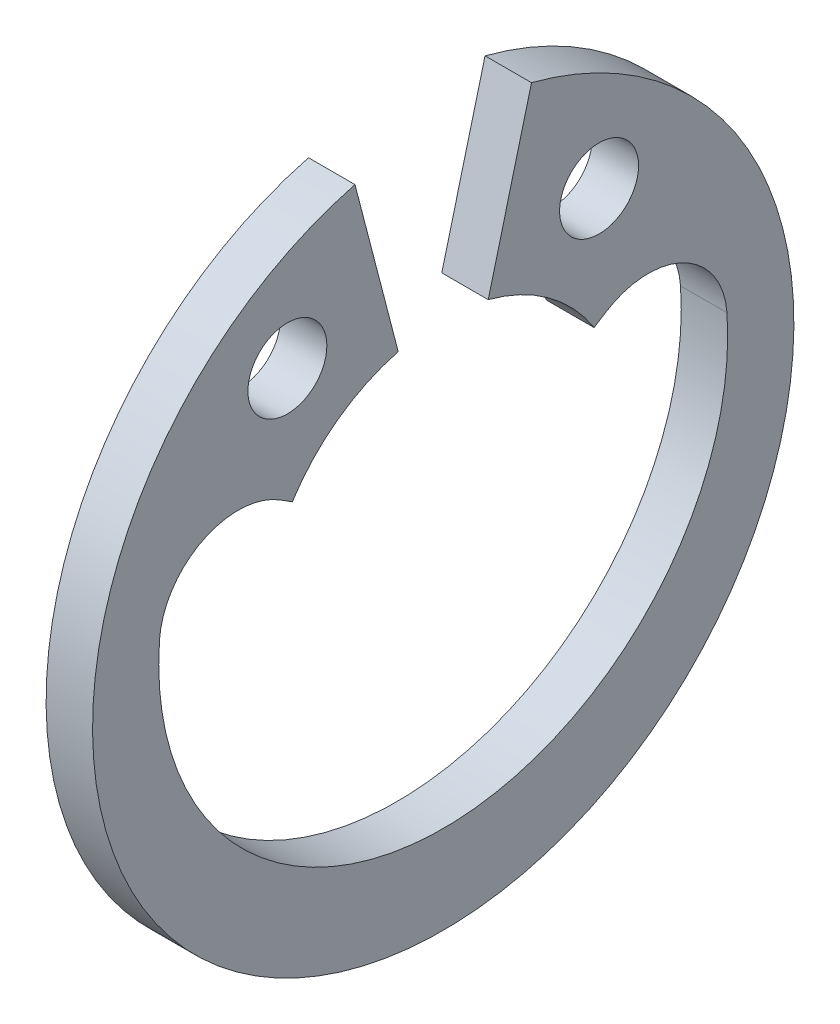
ISO-10303-21;
HEADER;
FILE_DESCRIPTION(('STEP AP214'),'2;1');
FILE_NAME('part.step','',(''),(''),'','','');
FILE_SCHEMA(('AUTOMOTIVE_DESIGN { 1 0 10303 214 1 1 1 1 }'));
ENDSEC;
DATA;
#1=APPLICATION_CONTEXT('core data for automotive mechanical design processes');
#2=APPLICATION_PROTOCOL_DEFINITION('international standard','automotive_design',2000,#1);
#3=PRODUCT_CONTEXT('',#1,'mechanical');
#4=PRODUCT('Part','Part','',(#3));
#5=PRODUCT_RELATED_PRODUCT_CATEGORY('part','',(#4));
#6=PRODUCT_DEFINITION_FORMATION('','',#4);
#7=PRODUCT_DEFINITION_CONTEXT('part definition',#1,'design');
#8=PRODUCT_DEFINITION('design','',#6,#7);
#9=PRODUCT_DEFINITION_SHAPE('','',#8);
#10=(LENGTH_UNIT() NAMED_UNIT(*) SI_UNIT(.MILLI.,.METRE.));
#11=(NAMED_UNIT(*) PLANE_ANGLE_UNIT() SI_UNIT($,.RADIAN.));
#12=(NAMED_UNIT(*) SI_UNIT($,.STERADIAN.) SOLID_ANGLE_UNIT());
#13=UNCERTAINTY_MEASURE_WITH_UNIT(LENGTH_MEASURE(1.E-05),#10,'distance_accuracy_value','');
#14=(GEOMETRIC_REPRESENTATION_CONTEXT(3) GLOBAL_UNCERTAINTY_ASSIGNED_CONTEXT((#13)) GLOBAL_UNIT_ASSIGNED_CONTEXT((#10,
#11,#12)) REPRESENTATION_CONTEXT('',''));
#15=CARTESIAN_POINT('',(0.,0.,0.));
#16=DIRECTION('',(0.,0.,1.));
#17=DIRECTION('',(1.,0.,0.));
#18=AXIS2_PLACEMENT_3D('',#15,#16,#17);
#19=CARTESIAN_POINT('',(0.,0.,0.));
#20=DIRECTION('',(1.,0.,0.));
#21=DIRECTION('',(0.,0.,-1.));
#22=AXIS2_PLACEMENT_3D('',#19,#20,#21);
#23=PLANE('',#22);
#24=DIRECTION('',(0.,0.967816844409425,0.251655629139073));
#25=VECTOR('',#24,1.);
#26=CARTESIAN_POINT('',(0.,3.72609485097629,0.968874172185431));
#27=LINE('',#26,#25);
#28=CARTESIAN_POINT('',(0.,3.72609485097629,0.968874172185432));
#29=VERTEX_POINT('',#28);
#30=CARTESIAN_POINT('',(0.,7.30701717529116,1.9));
#31=VERTEX_POINT('',#30);
#32=EDGE_CURVE('E173',#29,#31,#27,.T.);
#33=ORIENTED_EDGE('',*,*,#32,.F.);
#34=CARTESIAN_POINT('',(0.,0.,0.));
#35=DIRECTION('',(1.,0.,0.));
#36=DIRECTION('',(0.,0.,-1.));
#37=AXIS2_PLACEMENT_3D('',#34,#35,#36);
#38=CIRCLE('',#37,3.85);
#39=CARTESIAN_POINT('',(0.,2.0659171332523,3.24876690430917));
#40=VERTEX_POINT('',#39);
#41=EDGE_CURVE('E160',#29,#40,#38,.T.);
#42=ORIENTED_EDGE('',*,*,#41,.T.);
#43=DIRECTION('',(0.,-0.536601852792805,-0.843835559560824));
#44=VECTOR('',#43,1.);
#45=CARTESIAN_POINT('',(0.,2.22657105384902,3.50140392051924));
#46=LINE('',#45,#44);
#47=CARTESIAN_POINT('',(0.,2.22657105384902,3.50140392051924));
#48=VERTEX_POINT('',#47);
#49=EDGE_CURVE('E25',#48,#40,#46,.T.);
#50=ORIENTED_EDGE('',*,*,#49,.F.);
#51=CARTESIAN_POINT('',(0.,0.792050602595623,4.41362707026701));
#52=DIRECTION('',(1.,0.,0.));
#53=DIRECTION('',(0.,0.,-1.));
#54=AXIS2_PLACEMENT_3D('',#51,#52,#53);
#55=CIRCLE('',#54,1.7);
#56=CARTESIAN_POINT('',(0.,0.913855353875306,6.10925780912665));
#57=VERTEX_POINT('',#56);
#58=EDGE_CURVE('E102',#48,#57,#55,.T.);
#59=ORIENTED_EDGE('',*,*,#58,.T.);
#60=CARTESIAN_POINT('',(0.,0.475000000000007,0.));
#61=DIRECTION('',(1.,0.,0.));
#62=DIRECTION('',(0.,0.,-1.));
#63=AXIS2_PLACEMENT_3D('',#60,#61,#62);
#64=CIRCLE('',#63,6.125);
#65=CARTESIAN_POINT('',(0.,0.91385535387529,-6.10925780912666));
#66=VERTEX_POINT('',#65);
#67=EDGE_CURVE('E127',#57,#66,#64,.T.);
#68=ORIENTED_EDGE('',*,*,#67,.T.);
#69=CARTESIAN_POINT('',(0.,0.792050602595623,-4.41362707026701));
#70=DIRECTION('',(1.,0.,0.));
#71=DIRECTION('',(0.,0.,-1.));
#72=AXIS2_PLACEMENT_3D('',#69,#70,#71);
#73=CIRCLE('',#72,1.7);
#74=CARTESIAN_POINT('',(0.,2.22657105384902,-3.50140392051923));
#75=VERTEX_POINT('',#74);
#76=EDGE_CURVE('E132',#66,#75,#73,.T.);
#77=ORIENTED_EDGE('',*,*,#76,.T.);
#78=DIRECTION('',(0.,0.53660185279281,-0.843835559560821));
#79=VECTOR('',#78,1.);
#80=CARTESIAN_POINT('',(0.,2.0659171332523,-3.24876690430917));
#81=LINE('',#80,#79);
#82=CARTESIAN_POINT('',(0.,2.0659171332523,-3.24876690430917));
#83=VERTEX_POINT('',#82);
#84=EDGE_CURVE('E142',#83,#75,#81,.T.);
#85=ORIENTED_EDGE('',*,*,#84,.F.);
#86=CARTESIAN_POINT('',(0.,0.,0.));
#87=DIRECTION('',(1.,0.,0.));
#88=DIRECTION('',(0.,0.,-1.));
#89=AXIS2_PLACEMENT_3D('',#86,#87,#88);
#90=CIRCLE('',#89,3.85);
#91=CARTESIAN_POINT('',(0.,3.72609485097629,-0.96887417218543));
#92=VERTEX_POINT('',#91);
#93=EDGE_CURVE('E143',#83,#92,#90,.T.);
#94=ORIENTED_EDGE('',*,*,#93,.T.);
#95=DIRECTION('',(0.,-0.967816844409425,0.251655629139073));
#96=VECTOR('',#95,1.);
#97=CARTESIAN_POINT('',(0.,7.30701717529116,-1.9));
#98=LINE('',#97,#96);
#99=CARTESIAN_POINT('',(0.,7.30701717529116,-1.9));
#100=VERTEX_POINT('',#99);
#101=EDGE_CURVE('E180',#100,#92,#98,.T.);
#102=ORIENTED_EDGE('',*,*,#101,.F.);
#103=CARTESIAN_POINT('',(0.,0.,0.));
#104=DIRECTION('',(1.,0.,0.));
#105=DIRECTION('',(0.,0.,-1.));
#106=AXIS2_PLACEMENT_3D('',#103,#104,#105);
#107=CIRCLE('',#106,7.55);
#108=EDGE_CURVE('E161',#31,#100,#107,.T.);
#109=ORIENTED_EDGE('',*,*,#108,.F.);
#110=EDGE_LOOP('',(#33,#42,#50,#59,#68,#77,#85,#94,#102,#109));
#111=FACE_BOUND('',#110,.T.);
#112=CARTESIAN_POINT('',(0.,4.60780106948882,-3.35531955318979));
#113=DIRECTION('',(1.,0.,0.));
#114=DIRECTION('',(0.,0.,-1.));
#115=AXIS2_PLACEMENT_3D('',#112,#113,#114);
#116=CIRCLE('',#115,0.85);
#117=CARTESIAN_POINT('',(0.,4.60780106948882,-4.20531955318979));
#118=VERTEX_POINT('',#117);
#119=EDGE_CURVE('E9',#118,#118,#116,.T.);
#120=ORIENTED_EDGE('',*,*,#119,.T.);
#121=EDGE_LOOP('',(#120));
#122=FACE_BOUND('',#121,.T.);
#123=CARTESIAN_POINT('',(0.,4.60780106948882,3.35531955318979));
#124=DIRECTION('',(1.,0.,0.));
#125=DIRECTION('',(0.,0.,-1.));
#126=AXIS2_PLACEMENT_3D('',#123,#124,#125);
#127=CIRCLE('',#126,0.85);
#128=CARTESIAN_POINT('',(0.,4.60780106948882,2.50531955318979));
#129=VERTEX_POINT('',#128);
#130=EDGE_CURVE('E114',#129,#129,#127,.T.);
#131=ORIENTED_EDGE('',*,*,#130,.T.);
#132=EDGE_LOOP('',(#131));
#133=FACE_BOUND('',#132,.T.);
#134=ADVANCED_FACE('F15',(#111,#122,#133),#23,.F.);
#135=CARTESIAN_POINT('',(1.,4.60780106948882,-3.35531955318979));
#136=DIRECTION('',(-1.,0.,0.));
#137=DIRECTION('',(0.,0.,1.));
#138=AXIS2_PLACEMENT_3D('',#135,#136,#137);
#139=CYLINDRICAL_SURFACE('',#138,0.85);
#140=ORIENTED_EDGE('',*,*,#119,.F.);
#141=EDGE_LOOP('',(#140));
#142=FACE_BOUND('',#141,.T.);
#143=CARTESIAN_POINT('',(1.,4.60780106948882,-3.35531955318979));
#144=DIRECTION('',(1.,0.,0.));
#145=DIRECTION('',(0.,0.,-1.));
#146=AXIS2_PLACEMENT_3D('',#143,#144,#145);
#147=CIRCLE('',#146,0.85);
#148=CARTESIAN_POINT('',(1.,4.60780106948882,-4.20531955318979));
#149=VERTEX_POINT('',#148);
#150=EDGE_CURVE('E138',#149,#149,#147,.T.);
#151=ORIENTED_EDGE('',*,*,#150,.T.);
#152=EDGE_LOOP('',(#151));
#153=FACE_BOUND('',#152,.T.);
#154=ADVANCED_FACE('F213',(#142,#153),#139,.F.);
#155=CARTESIAN_POINT('',(1.,2.22657105384902,3.50140392051924));
#156=DIRECTION('',(0.,0.843835559560824,-0.536601852792805));
#157=DIRECTION('',(0.,0.536601852792805,0.843835559560824));
#158=AXIS2_PLACEMENT_3D('',#155,#156,#157);
#159=PLANE('',#158);
#160=ORIENTED_EDGE('',*,*,#49,.T.);
#161=DIRECTION('',(-1.,0.,0.));
#162=VECTOR('',#161,1.);
#163=CARTESIAN_POINT('',(1.,2.0659171332523,3.24876690430917));
#164=LINE('',#163,#162);
#165=CARTESIAN_POINT('',(1.,2.0659171332523,3.24876690430917));
#166=VERTEX_POINT('',#165);
#167=EDGE_CURVE('E110',#166,#40,#164,.T.);
#168=ORIENTED_EDGE('',*,*,#167,.F.);
#169=DIRECTION('',(0.,-0.536601852792805,-0.843835559560824));
#170=VECTOR('',#169,1.);
#171=CARTESIAN_POINT('',(1.,2.22657105384902,3.50140392051924));
#172=LINE('',#171,#170);
#173=CARTESIAN_POINT('',(1.,2.22657105384902,3.50140392051924));
#174=VERTEX_POINT('',#173);
#175=EDGE_CURVE('E107',#174,#166,#172,.T.);
#176=ORIENTED_EDGE('',*,*,#175,.F.);
#177=DIRECTION('',(-1.,0.,0.));
#178=VECTOR('',#177,1.);
#179=CARTESIAN_POINT('',(1.,2.22657105384902,3.50140392051924));
#180=LINE('',#179,#178);
#181=EDGE_CURVE('E95',#174,#48,#180,.T.);
#182=ORIENTED_EDGE('',*,*,#181,.T.);
#183=EDGE_LOOP('',(#160,#168,#176,#182));
#184=FACE_BOUND('',#183,.T.);
#185=ADVANCED_FACE('F108',(#184),#159,.F.);
#186=CARTESIAN_POINT('',(1.,0.792050602595623,4.41362707026701));
#187=DIRECTION('',(-1.,0.,0.));
#188=DIRECTION('',(0.,0.,1.));
#189=AXIS2_PLACEMENT_3D('',#186,#187,#188);
#190=CYLINDRICAL_SURFACE('',#189,1.7);
#191=ORIENTED_EDGE('',*,*,#58,.F.);
#192=ORIENTED_EDGE('',*,*,#181,.F.);
#193=CARTESIAN_POINT('',(1.,0.792050602595623,4.41362707026701));
#194=DIRECTION('',(1.,0.,0.));
#195=DIRECTION('',(0.,0.,-1.));
#196=AXIS2_PLACEMENT_3D('',#193,#194,#195);
#197=CIRCLE('',#196,1.7);
#198=CARTESIAN_POINT('',(1.,0.913855353875306,6.10925780912665));
#199=VERTEX_POINT('',#198);
#200=EDGE_CURVE('E100',#174,#199,#197,.T.);
#201=ORIENTED_EDGE('',*,*,#200,.T.);
#202=DIRECTION('',(-1.,0.,0.));
#203=VECTOR('',#202,1.);
#204=CARTESIAN_POINT('',(1.,0.913855353875306,6.10925780912665));
#205=LINE('',#204,#203);
#206=EDGE_CURVE('E155',#199,#57,#205,.T.);
#207=ORIENTED_EDGE('',*,*,#206,.T.);
#208=EDGE_LOOP('',(#191,#192,#201,#207));
#209=FACE_BOUND('',#208,.T.);
#210=ADVANCED_FACE('F97',(#209),#190,.F.);
#211=CARTESIAN_POINT('',(1.,0.475000000000007,0.));
#212=DIRECTION('',(-1.,0.,0.));
#213=DIRECTION('',(0.,0.,1.));
#214=AXIS2_PLACEMENT_3D('',#211,#212,#213);
#215=CYLINDRICAL_SURFACE('',#214,6.125);
#216=ORIENTED_EDGE('',*,*,#67,.F.);
#217=ORIENTED_EDGE('',*,*,#206,.F.);
#218=CARTESIAN_POINT('',(1.,0.475000000000007,0.));
#219=DIRECTION('',(1.,0.,0.));
#220=DIRECTION('',(0.,0.,-1.));
#221=AXIS2_PLACEMENT_3D('',#218,#219,#220);
#222=CIRCLE('',#221,6.125);
#223=CARTESIAN_POINT('',(1.,0.91385535387529,-6.10925780912666));
#224=VERTEX_POINT('',#223);
#225=EDGE_CURVE('E121',#199,#224,#222,.T.);
#226=ORIENTED_EDGE('',*,*,#225,.T.);
#227=DIRECTION('',(-1.,0.,0.));
#228=VECTOR('',#227,1.);
#229=CARTESIAN_POINT('',(1.,0.91385535387529,-6.10925780912666));
#230=LINE('',#229,#228);
#231=EDGE_CURVE('E129',#224,#66,#230,.T.);
#232=ORIENTED_EDGE('',*,*,#231,.T.);
#233=EDGE_LOOP('',(#216,#217,#226,#232));
#234=FACE_BOUND('',#233,.T.);
#235=ADVANCED_FACE('F242',(#234),#215,.F.);
#236=CARTESIAN_POINT('',(1.,0.792050602595623,-4.41362707026701));
#237=DIRECTION('',(-1.,0.,0.));
#238=DIRECTION('',(0.,0.,1.));
#239=AXIS2_PLACEMENT_3D('',#236,#237,#238);
#240=CYLINDRICAL_SURFACE('',#239,1.7);
#241=ORIENTED_EDGE('',*,*,#76,.F.);
#242=ORIENTED_EDGE('',*,*,#231,.F.);
#243=CARTESIAN_POINT('',(1.,0.792050602595623,-4.41362707026701));
#244=DIRECTION('',(1.,0.,0.));
#245=DIRECTION('',(0.,0.,-1.));
#246=AXIS2_PLACEMENT_3D('',#243,#244,#245);
#247=CIRCLE('',#246,1.7);
#248=CARTESIAN_POINT('',(1.,2.22657105384902,-3.50140392051923));
#249=VERTEX_POINT('',#248);
#250=EDGE_CURVE('E123',#224,#249,#247,.T.);
#251=ORIENTED_EDGE('',*,*,#250,.T.);
#252=DIRECTION('',(-1.,0.,0.));
#253=VECTOR('',#252,1.);
#254=CARTESIAN_POINT('',(1.,2.22657105384902,-3.50140392051923));
#255=LINE('',#254,#253);
#256=EDGE_CURVE('E133',#249,#75,#255,.T.);
#257=ORIENTED_EDGE('',*,*,#256,.T.);
#258=EDGE_LOOP('',(#241,#242,#251,#257));
#259=FACE_BOUND('',#258,.T.);
#260=ADVANCED_FACE('F223',(#259),#240,.F.);
#261=CARTESIAN_POINT('',(1.,2.0659171332523,-3.24876690430917));
#262=DIRECTION('',(0.,0.843835559560821,0.53660185279281));
#263=DIRECTION('',(0.,-0.53660185279281,0.843835559560821));
#264=AXIS2_PLACEMENT_3D('',#261,#262,#263);
#265=PLANE('',#264);
#266=ORIENTED_EDGE('',*,*,#84,.T.);
#267=ORIENTED_EDGE('',*,*,#256,.F.);
#268=DIRECTION('',(0.,0.53660185279281,-0.843835559560821));
#269=VECTOR('',#268,1.);
#270=CARTESIAN_POINT('',(1.,2.0659171332523,-3.24876690430917));
#271=LINE('',#270,#269);
#272=CARTESIAN_POINT('',(1.,2.0659171332523,-3.24876690430917));
#273=VERTEX_POINT('',#272);
#274=EDGE_CURVE('E168',#273,#249,#271,.T.);
#275=ORIENTED_EDGE('',*,*,#274,.F.);
#276=DIRECTION('',(-1.,0.,0.));
#277=VECTOR('',#276,1.);
#278=CARTESIAN_POINT('',(1.,2.0659171332523,-3.24876690430917));
#279=LINE('',#278,#277);
#280=EDGE_CURVE('E139',#273,#83,#279,.T.);
#281=ORIENTED_EDGE('',*,*,#280,.T.);
#282=EDGE_LOOP('',(#266,#267,#275,#281));
#283=FACE_BOUND('',#282,.T.);
#284=ADVANCED_FACE('F220',(#283),#265,.F.);
#285=CARTESIAN_POINT('',(1.,0.,0.));
#286=DIRECTION('',(-1.,0.,0.));
#287=DIRECTION('',(0.,0.,1.));
#288=AXIS2_PLACEMENT_3D('',#285,#286,#287);
#289=CYLINDRICAL_SURFACE('',#288,3.85);
#290=ORIENTED_EDGE('',*,*,#93,.F.);
#291=ORIENTED_EDGE('',*,*,#280,.F.);
#292=CARTESIAN_POINT('',(1.,0.,0.));
#293=DIRECTION('',(1.,0.,0.));
#294=DIRECTION('',(0.,0.,-1.));
#295=AXIS2_PLACEMENT_3D('',#292,#293,#294);
#296=CIRCLE('',#295,3.85);
#297=CARTESIAN_POINT('',(1.,3.72609485097629,-0.96887417218543));
#298=VERTEX_POINT('',#297);
#299=EDGE_CURVE('E170',#273,#298,#296,.T.);
#300=ORIENTED_EDGE('',*,*,#299,.T.);
#301=DIRECTION('',(-1.,0.,0.));
#302=VECTOR('',#301,1.);
#303=CARTESIAN_POINT('',(1.,3.72609485097629,-0.96887417218543));
#304=LINE('',#303,#302);
#305=EDGE_CURVE('E19',#298,#92,#304,.T.);
#306=ORIENTED_EDGE('',*,*,#305,.T.);
#307=EDGE_LOOP('',(#290,#291,#300,#306));
#308=FACE_BOUND('',#307,.T.);
#309=ADVANCED_FACE('F222',(#308),#289,.F.);
#310=CARTESIAN_POINT('',(1.,7.30701717529116,-1.9));
#311=DIRECTION('',(0.,-0.251655629139073,-0.967816844409425));
#312=DIRECTION('',(0.,0.967816844409425,-0.251655629139073));
#313=AXIS2_PLACEMENT_3D('',#310,#311,#312);
#314=PLANE('',#313);
#315=ORIENTED_EDGE('',*,*,#101,.T.);
#316=ORIENTED_EDGE('',*,*,#305,.F.);
#317=DIRECTION('',(0.,-0.967816844409425,0.251655629139073));
#318=VECTOR('',#317,1.);
#319=CARTESIAN_POINT('',(1.,7.30701717529116,-1.9));
#320=LINE('',#319,#318);
#321=CARTESIAN_POINT('',(1.,7.30701717529116,-1.9));
#322=VERTEX_POINT('',#321);
#323=EDGE_CURVE('E149',#322,#298,#320,.T.);
#324=ORIENTED_EDGE('',*,*,#323,.F.);
#325=DIRECTION('',(-1.,0.,0.));
#326=VECTOR('',#325,1.);
#327=CARTESIAN_POINT('',(1.,7.30701717529116,-1.9));
#328=LINE('',#327,#326);
#329=EDGE_CURVE('E164',#322,#100,#328,.T.);
#330=ORIENTED_EDGE('',*,*,#329,.T.);
#331=EDGE_LOOP('',(#315,#316,#324,#330));
#332=FACE_BOUND('',#331,.T.);
#333=ADVANCED_FACE('F225',(#332),#314,.F.);
#334=CARTESIAN_POINT('',(1.,0.,0.));
#335=DIRECTION('',(-1.,0.,0.));
#336=DIRECTION('',(0.,0.,1.));
#337=AXIS2_PLACEMENT_3D('',#334,#335,#336);
#338=CYLINDRICAL_SURFACE('',#337,7.55);
#339=ORIENTED_EDGE('',*,*,#108,.T.);
#340=ORIENTED_EDGE('',*,*,#329,.F.);
#341=CARTESIAN_POINT('',(1.,0.,0.));
#342=DIRECTION('',(1.,0.,0.));
#343=DIRECTION('',(0.,0.,-1.));
#344=AXIS2_PLACEMENT_3D('',#341,#342,#343);
#345=CIRCLE('',#344,7.55);
#346=CARTESIAN_POINT('',(1.,7.30701717529116,1.9));
#347=VERTEX_POINT('',#346);
#348=EDGE_CURVE('E137',#347,#322,#345,.T.);
#349=ORIENTED_EDGE('',*,*,#348,.F.);
#350=DIRECTION('',(-1.,0.,0.));
#351=VECTOR('',#350,1.);
#352=CARTESIAN_POINT('',(1.,7.30701717529116,1.9));
#353=LINE('',#352,#351);
#354=EDGE_CURVE('E165',#347,#31,#353,.T.);
#355=ORIENTED_EDGE('',*,*,#354,.T.);
#356=EDGE_LOOP('',(#339,#340,#349,#355));
#357=FACE_BOUND('',#356,.T.);
#358=ADVANCED_FACE('F227',(#357),#338,.T.);
#359=CARTESIAN_POINT('',(1.,3.72609485097629,0.968874172185431));
#360=DIRECTION('',(0.,-0.251655629139073,0.967816844409425));
#361=DIRECTION('',(0.,-0.967816844409425,-0.251655629139073));
#362=AXIS2_PLACEMENT_3D('',#359,#360,#361);
#363=PLANE('',#362);
#364=ORIENTED_EDGE('',*,*,#32,.T.);
#365=ORIENTED_EDGE('',*,*,#354,.F.);
#366=DIRECTION('',(0.,0.967816844409425,0.251655629139073));
#367=VECTOR('',#366,1.);
#368=CARTESIAN_POINT('',(1.,3.72609485097629,0.968874172185431));
#369=LINE('',#368,#367);
#370=CARTESIAN_POINT('',(1.,3.72609485097629,0.968874172185432));
#371=VERTEX_POINT('',#370);
#372=EDGE_CURVE('E135',#371,#347,#369,.T.);
#373=ORIENTED_EDGE('',*,*,#372,.F.);
#374=DIRECTION('',(-1.,0.,0.));
#375=VECTOR('',#374,1.);
#376=CARTESIAN_POINT('',(1.,3.72609485097629,0.968874172185432));
#377=LINE('',#376,#375);
#378=EDGE_CURVE('E157',#371,#29,#377,.T.);
#379=ORIENTED_EDGE('',*,*,#378,.T.);
#380=EDGE_LOOP('',(#364,#365,#373,#379));
#381=FACE_BOUND('',#380,.T.);
#382=ADVANCED_FACE('F198',(#381),#363,.F.);
#383=CARTESIAN_POINT('',(1.,4.60780106948882,3.35531955318979));
#384=DIRECTION('',(-1.,0.,0.));
#385=DIRECTION('',(0.,0.,1.));
#386=AXIS2_PLACEMENT_3D('',#383,#384,#385);
#387=CYLINDRICAL_SURFACE('',#386,0.85);
#388=ORIENTED_EDGE('',*,*,#130,.F.);
#389=EDGE_LOOP('',(#388));
#390=FACE_BOUND('',#389,.T.);
#391=CARTESIAN_POINT('',(1.,4.60780106948882,3.35531955318979));
#392=DIRECTION('',(1.,0.,0.));
#393=DIRECTION('',(0.,0.,-1.));
#394=AXIS2_PLACEMENT_3D('',#391,#392,#393);
#395=CIRCLE('',#394,0.85);
#396=CARTESIAN_POINT('',(1.,4.60780106948882,2.50531955318979));
#397=VERTEX_POINT('',#396);
#398=EDGE_CURVE('E144',#397,#397,#395,.T.);
#399=ORIENTED_EDGE('',*,*,#398,.T.);
#400=EDGE_LOOP('',(#399));
#401=FACE_BOUND('',#400,.T.);
#402=ADVANCED_FACE('F17',(#390,#401),#387,.F.);
#403=CARTESIAN_POINT('',(1.,0.,0.));
#404=DIRECTION('',(1.,0.,0.));
#405=DIRECTION('',(0.,0.,-1.));
#406=AXIS2_PLACEMENT_3D('',#403,#404,#405);
#407=PLANE('',#406);
#408=ORIENTED_EDGE('',*,*,#372,.T.);
#409=ORIENTED_EDGE('',*,*,#348,.T.);
#410=ORIENTED_EDGE('',*,*,#323,.T.);
#411=ORIENTED_EDGE('',*,*,#299,.F.);
#412=ORIENTED_EDGE('',*,*,#274,.T.);
#413=ORIENTED_EDGE('',*,*,#250,.F.);
#414=ORIENTED_EDGE('',*,*,#225,.F.);
#415=ORIENTED_EDGE('',*,*,#200,.F.);
#416=ORIENTED_EDGE('',*,*,#175,.T.);
#417=CARTESIAN_POINT('',(1.,0.,0.));
#418=DIRECTION('',(1.,0.,0.));
#419=DIRECTION('',(0.,0.,-1.));
#420=AXIS2_PLACEMENT_3D('',#417,#418,#419);
#421=CIRCLE('',#420,3.85);
#422=EDGE_CURVE('E145',#371,#166,#421,.T.);
#423=ORIENTED_EDGE('',*,*,#422,.F.);
#424=EDGE_LOOP('',(#408,#409,#410,#411,#412,#413,#414,#415,#416,#423));
#425=FACE_BOUND('',#424,.T.);
#426=ORIENTED_EDGE('',*,*,#150,.F.);
#427=EDGE_LOOP('',(#426));
#428=FACE_BOUND('',#427,.T.);
#429=ORIENTED_EDGE('',*,*,#398,.F.);
#430=EDGE_LOOP('',(#429));
#431=FACE_BOUND('',#430,.T.);
#432=ADVANCED_FACE('F117',(#425,#428,#431),#407,.T.);
#433=CARTESIAN_POINT('',(1.,0.,0.));
#434=DIRECTION('',(-1.,0.,0.));
#435=DIRECTION('',(0.,0.,1.));
#436=AXIS2_PLACEMENT_3D('',#433,#434,#435);
#437=CYLINDRICAL_SURFACE('',#436,3.85);
#438=ORIENTED_EDGE('',*,*,#41,.F.);
#439=ORIENTED_EDGE('',*,*,#378,.F.);
#440=ORIENTED_EDGE('',*,*,#422,.T.);
#441=ORIENTED_EDGE('',*,*,#167,.T.);
#442=EDGE_LOOP('',(#438,#439,#440,#441));
#443=FACE_BOUND('',#442,.T.);
#444=ADVANCED_FACE('F202',(#443),#437,.F.);
#445=CLOSED_SHELL('',(#134,#154,#185,#210,#235,#260,#284,#309,#333,#358,#382,#402,#432,#444));
#446=MANIFOLD_SOLID_BREP('B1',#445);
#447=ADVANCED_BREP_SHAPE_REPRESENTATION('',(#18,#446),#14);
#448=SHAPE_DEFINITION_REPRESENTATION(#9,#447);
ENDSEC;
END-ISO-10303-21;
